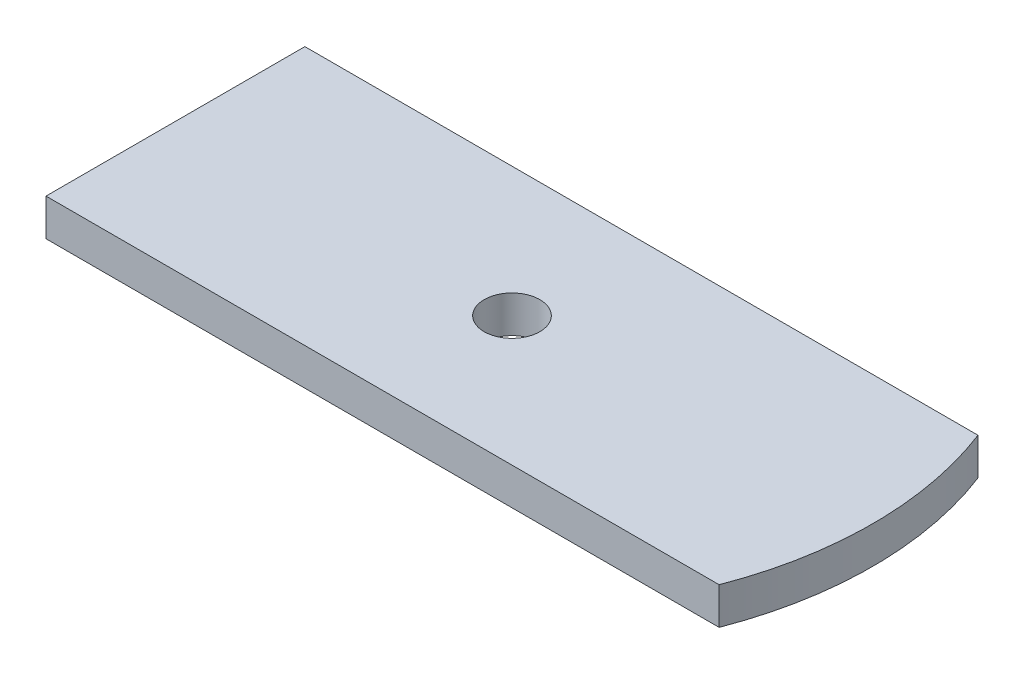
ISO-10303-21;
HEADER;
FILE_DESCRIPTION(('STEP AP214'),'2;1');
FILE_NAME('part.step','',(''),(''),'','','');
FILE_SCHEMA(('AUTOMOTIVE_DESIGN { 1 0 10303 214 1 1 1 1 }'));
ENDSEC;
DATA;
#1=APPLICATION_CONTEXT('core data for automotive mechanical design processes');
#2=APPLICATION_PROTOCOL_DEFINITION('international standard','automotive_design',2000,#1);
#3=PRODUCT_CONTEXT('',#1,'mechanical');
#4=PRODUCT('Part','Part','',(#3));
#5=PRODUCT_RELATED_PRODUCT_CATEGORY('part','',(#4));
#6=PRODUCT_DEFINITION_FORMATION('','',#4);
#7=PRODUCT_DEFINITION_CONTEXT('part definition',#1,'design');
#8=PRODUCT_DEFINITION('design','',#6,#7);
#9=PRODUCT_DEFINITION_SHAPE('','',#8);
#10=(LENGTH_UNIT() NAMED_UNIT(*) SI_UNIT(.MILLI.,.METRE.));
#11=(NAMED_UNIT(*) PLANE_ANGLE_UNIT() SI_UNIT($,.RADIAN.));
#12=(NAMED_UNIT(*) SI_UNIT($,.STERADIAN.) SOLID_ANGLE_UNIT());
#13=UNCERTAINTY_MEASURE_WITH_UNIT(LENGTH_MEASURE(1.E-05),#10,'distance_accuracy_value','');
#14=(GEOMETRIC_REPRESENTATION_CONTEXT(3) GLOBAL_UNCERTAINTY_ASSIGNED_CONTEXT((#13)) GLOBAL_UNIT_ASSIGNED_CONTEXT((#10,
#11,#12)) REPRESENTATION_CONTEXT('',''));
#15=CARTESIAN_POINT('',(0.,0.,0.));
#16=DIRECTION('',(0.,0.,1.));
#17=DIRECTION('',(1.,0.,0.));
#18=AXIS2_PLACEMENT_3D('',#15,#16,#17);
#19=CARTESIAN_POINT('',(0.,20.,0.));
#20=DIRECTION('',(0.,-1.,0.));
#21=DIRECTION('',(0.,0.,-1.));
#22=AXIS2_PLACEMENT_3D('',#19,#20,#21);
#23=PLANE('',#22);
#24=DIRECTION('',(0.,0.,1.));
#25=VECTOR('',#24,1.);
#26=CARTESIAN_POINT('',(-182.002747232045,20.,-70.));
#27=LINE('',#26,#25);
#28=CARTESIAN_POINT('',(-182.002747232045,20.,-70.));
#29=VERTEX_POINT('',#28);
#30=CARTESIAN_POINT('',(-182.002747232045,20.,70.0000000000001));
#31=VERTEX_POINT('',#30);
#32=EDGE_CURVE('E87',#29,#31,#27,.T.);
#33=ORIENTED_EDGE('',*,*,#32,.T.);
#34=DIRECTION('',(1.,0.,0.));
#35=VECTOR('',#34,1.);
#36=CARTESIAN_POINT('',(182.002747232045,20.,70.));
#37=LINE('',#36,#35);
#38=CARTESIAN_POINT('',(182.002747232045,20.,70.));
#39=VERTEX_POINT('',#38);
#40=EDGE_CURVE('E82',#31,#39,#37,.T.);
#41=ORIENTED_EDGE('',*,*,#40,.T.);
#42=CARTESIAN_POINT('',(0.,20.,0.));
#43=DIRECTION('',(0.,1.,0.));
#44=DIRECTION('',(0.,0.,-1.));
#45=AXIS2_PLACEMENT_3D('',#42,#43,#44);
#46=CIRCLE('',#45,195.00000000003);
#47=CARTESIAN_POINT('',(182.002747232045,20.,-70.));
#48=VERTEX_POINT('',#47);
#49=EDGE_CURVE('E85',#39,#48,#46,.T.);
#50=ORIENTED_EDGE('',*,*,#49,.T.);
#51=DIRECTION('',(-1.,0.,0.));
#52=VECTOR('',#51,1.);
#53=CARTESIAN_POINT('',(182.002747232045,20.,-70.));
#54=LINE('',#53,#52);
#55=EDGE_CURVE('E52',#48,#29,#54,.T.);
#56=ORIENTED_EDGE('',*,*,#55,.T.);
#57=EDGE_LOOP('',(#33,#41,#50,#56));
#58=FACE_BOUND('',#57,.T.);
#59=CARTESIAN_POINT('',(0.,20.,0.));
#60=DIRECTION('',(0.,1.,0.));
#61=DIRECTION('',(0.,0.,1.));
#62=AXIS2_PLACEMENT_3D('',#59,#60,#61);
#63=CIRCLE('',#62,15.05);
#64=CARTESIAN_POINT('',(0.,20.,15.05));
#65=VERTEX_POINT('',#64);
#66=EDGE_CURVE('E102',#65,#65,#63,.T.);
#67=ORIENTED_EDGE('',*,*,#66,.F.);
#68=EDGE_LOOP('',(#67));
#69=FACE_BOUND('',#68,.T.);
#70=ADVANCED_FACE('F35',(#58,#69),#23,.F.);
#71=CARTESIAN_POINT('',(0.,0.,0.));
#72=DIRECTION('',(0.,-1.,0.));
#73=DIRECTION('',(0.,0.,-1.));
#74=AXIS2_PLACEMENT_3D('',#71,#72,#73);
#75=PLANE('',#74);
#76=DIRECTION('',(0.,0.,1.));
#77=VECTOR('',#76,1.);
#78=CARTESIAN_POINT('',(-182.002747232045,0.,-70.));
#79=LINE('',#78,#77);
#80=CARTESIAN_POINT('',(-182.002747232045,0.,-70.));
#81=VERTEX_POINT('',#80);
#82=CARTESIAN_POINT('',(-182.002747232045,0.,70.0000000000001));
#83=VERTEX_POINT('',#82);
#84=EDGE_CURVE('E99',#81,#83,#79,.T.);
#85=ORIENTED_EDGE('',*,*,#84,.F.);
#86=DIRECTION('',(-1.,0.,0.));
#87=VECTOR('',#86,1.);
#88=CARTESIAN_POINT('',(182.002747232045,0.,-70.));
#89=LINE('',#88,#87);
#90=CARTESIAN_POINT('',(182.002747232045,0.,-70.));
#91=VERTEX_POINT('',#90);
#92=EDGE_CURVE('E75',#91,#81,#89,.T.);
#93=ORIENTED_EDGE('',*,*,#92,.F.);
#94=CARTESIAN_POINT('',(0.,0.,0.));
#95=DIRECTION('',(0.,1.,0.));
#96=DIRECTION('',(0.,0.,-1.));
#97=AXIS2_PLACEMENT_3D('',#94,#95,#96);
#98=CIRCLE('',#97,195.00000000003);
#99=CARTESIAN_POINT('',(182.002747232045,0.,70.));
#100=VERTEX_POINT('',#99);
#101=EDGE_CURVE('E69',#100,#91,#98,.T.);
#102=ORIENTED_EDGE('',*,*,#101,.F.);
#103=DIRECTION('',(1.,0.,0.));
#104=VECTOR('',#103,1.);
#105=CARTESIAN_POINT('',(182.002747232045,0.,70.));
#106=LINE('',#105,#104);
#107=EDGE_CURVE('E91',#83,#100,#106,.T.);
#108=ORIENTED_EDGE('',*,*,#107,.F.);
#109=EDGE_LOOP('',(#85,#93,#102,#108));
#110=FACE_BOUND('',#109,.T.);
#111=CARTESIAN_POINT('',(0.,0.,0.));
#112=DIRECTION('',(0.,1.,0.));
#113=DIRECTION('',(0.,0.,1.));
#114=AXIS2_PLACEMENT_3D('',#111,#112,#113);
#115=CIRCLE('',#114,15.05);
#116=CARTESIAN_POINT('',(0.,0.,15.05));
#117=VERTEX_POINT('',#116);
#118=EDGE_CURVE('E117',#117,#117,#115,.T.);
#119=ORIENTED_EDGE('',*,*,#118,.T.);
#120=EDGE_LOOP('',(#119));
#121=FACE_BOUND('',#120,.T.);
#122=ADVANCED_FACE('F110',(#110,#121),#75,.T.);
#123=CARTESIAN_POINT('',(-182.002747232045,20.,-70.));
#124=DIRECTION('',(1.,0.,0.));
#125=DIRECTION('',(0.,0.,-1.));
#126=AXIS2_PLACEMENT_3D('',#123,#124,#125);
#127=PLANE('',#126);
#128=ORIENTED_EDGE('',*,*,#84,.T.);
#129=DIRECTION('',(0.,-1.,0.));
#130=VECTOR('',#129,1.);
#131=CARTESIAN_POINT('',(-182.002747232045,20.,70.0000000000001));
#132=LINE('',#131,#130);
#133=EDGE_CURVE('E11',#31,#83,#132,.T.);
#134=ORIENTED_EDGE('',*,*,#133,.F.);
#135=ORIENTED_EDGE('',*,*,#32,.F.);
#136=DIRECTION('',(0.,-1.,0.));
#137=VECTOR('',#136,1.);
#138=CARTESIAN_POINT('',(-182.002747232045,20.,-70.));
#139=LINE('',#138,#137);
#140=EDGE_CURVE('E95',#29,#81,#139,.T.);
#141=ORIENTED_EDGE('',*,*,#140,.T.);
#142=EDGE_LOOP('',(#128,#134,#135,#141));
#143=FACE_BOUND('',#142,.T.);
#144=ADVANCED_FACE('F37',(#143),#127,.F.);
#145=CARTESIAN_POINT('',(182.002747232045,20.,70.));
#146=DIRECTION('',(0.,0.,-1.));
#147=DIRECTION('',(-1.,0.,0.));
#148=AXIS2_PLACEMENT_3D('',#145,#146,#147);
#149=PLANE('',#148);
#150=ORIENTED_EDGE('',*,*,#107,.T.);
#151=DIRECTION('',(0.,-1.,0.));
#152=VECTOR('',#151,1.);
#153=CARTESIAN_POINT('',(182.002747232045,20.,70.));
#154=LINE('',#153,#152);
#155=EDGE_CURVE('E44',#39,#100,#154,.T.);
#156=ORIENTED_EDGE('',*,*,#155,.F.);
#157=ORIENTED_EDGE('',*,*,#40,.F.);
#158=ORIENTED_EDGE('',*,*,#133,.T.);
#159=EDGE_LOOP('',(#150,#156,#157,#158));
#160=FACE_BOUND('',#159,.T.);
#161=ADVANCED_FACE('F90',(#160),#149,.F.);
#162=CARTESIAN_POINT('',(0.,20.,0.));
#163=DIRECTION('',(0.,-1.,0.));
#164=DIRECTION('',(0.,0.,-1.));
#165=AXIS2_PLACEMENT_3D('',#162,#163,#164);
#166=CYLINDRICAL_SURFACE('',#165,195.00000000003);
#167=ORIENTED_EDGE('',*,*,#101,.T.);
#168=DIRECTION('',(0.,-1.,0.));
#169=VECTOR('',#168,1.);
#170=CARTESIAN_POINT('',(182.002747232045,20.,-70.));
#171=LINE('',#170,#169);
#172=EDGE_CURVE('E92',#48,#91,#171,.T.);
#173=ORIENTED_EDGE('',*,*,#172,.F.);
#174=ORIENTED_EDGE('',*,*,#49,.F.);
#175=ORIENTED_EDGE('',*,*,#155,.T.);
#176=EDGE_LOOP('',(#167,#173,#174,#175));
#177=FACE_BOUND('',#176,.T.);
#178=ADVANCED_FACE('F93',(#177),#166,.T.);
#179=CARTESIAN_POINT('',(182.002747232045,20.,-70.));
#180=DIRECTION('',(0.,0.,1.));
#181=DIRECTION('',(1.,0.,0.));
#182=AXIS2_PLACEMENT_3D('',#179,#180,#181);
#183=PLANE('',#182);
#184=ORIENTED_EDGE('',*,*,#92,.T.);
#185=ORIENTED_EDGE('',*,*,#140,.F.);
#186=ORIENTED_EDGE('',*,*,#55,.F.);
#187=ORIENTED_EDGE('',*,*,#172,.T.);
#188=EDGE_LOOP('',(#184,#185,#186,#187));
#189=FACE_BOUND('',#188,.T.);
#190=ADVANCED_FACE('F107',(#189),#183,.F.);
#191=CARTESIAN_POINT('',(0.,20.,0.));
#192=DIRECTION('',(0.,-1.,0.));
#193=DIRECTION('',(0.,0.,-1.));
#194=AXIS2_PLACEMENT_3D('',#191,#192,#193);
#195=CYLINDRICAL_SURFACE('',#194,15.05);
#196=ORIENTED_EDGE('',*,*,#118,.F.);
#197=EDGE_LOOP('',(#196));
#198=FACE_BOUND('',#197,.T.);
#199=ORIENTED_EDGE('',*,*,#66,.T.);
#200=EDGE_LOOP('',(#199));
#201=FACE_BOUND('',#200,.T.);
#202=ADVANCED_FACE('F123',(#198,#201),#195,.F.);
#203=CLOSED_SHELL('',(#70,#122,#144,#161,#178,#190,#202));
#204=MANIFOLD_SOLID_BREP('B2',#203);
#205=ADVANCED_BREP_SHAPE_REPRESENTATION('',(#18,#204),#14);
#206=SHAPE_DEFINITION_REPRESENTATION(#9,#205);
ENDSEC;
END-ISO-10303-21;
